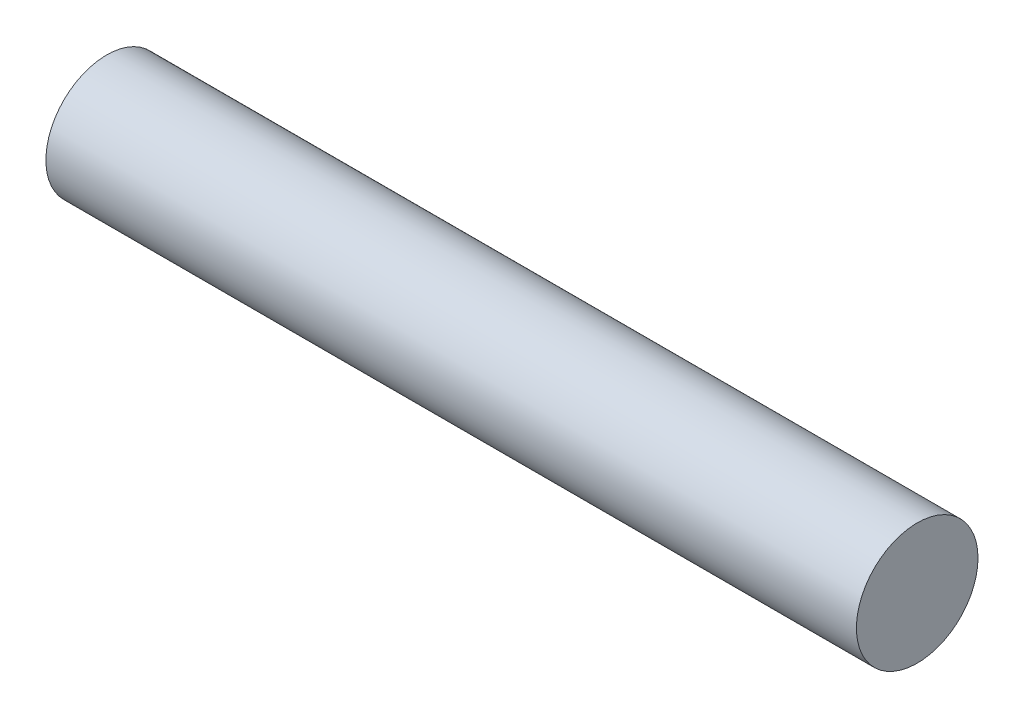
ISO-10303-21;
HEADER;
FILE_DESCRIPTION(('STEP AP214'),'2;1');
FILE_NAME('part.step','',(''),(''),'','','');
FILE_SCHEMA(('AUTOMOTIVE_DESIGN { 1 0 10303 214 1 1 1 1 }'));
ENDSEC;
DATA;
#1=APPLICATION_CONTEXT('core data for automotive mechanical design processes');
#2=APPLICATION_PROTOCOL_DEFINITION('international standard','automotive_design',2000,#1);
#3=PRODUCT_CONTEXT('',#1,'mechanical');
#4=PRODUCT('Part','Part','',(#3));
#5=PRODUCT_RELATED_PRODUCT_CATEGORY('part','',(#4));
#6=PRODUCT_DEFINITION_FORMATION('','',#4);
#7=PRODUCT_DEFINITION_CONTEXT('part definition',#1,'design');
#8=PRODUCT_DEFINITION('design','',#6,#7);
#9=PRODUCT_DEFINITION_SHAPE('','',#8);
#10=(LENGTH_UNIT() NAMED_UNIT(*) SI_UNIT(.MILLI.,.METRE.));
#11=(NAMED_UNIT(*) PLANE_ANGLE_UNIT() SI_UNIT($,.RADIAN.));
#12=(NAMED_UNIT(*) SI_UNIT($,.STERADIAN.) SOLID_ANGLE_UNIT());
#13=UNCERTAINTY_MEASURE_WITH_UNIT(LENGTH_MEASURE(1.E-05),#10,'distance_accuracy_value','');
#14=(GEOMETRIC_REPRESENTATION_CONTEXT(3) GLOBAL_UNCERTAINTY_ASSIGNED_CONTEXT((#13)) GLOBAL_UNIT_ASSIGNED_CONTEXT((#10,
#11,#12)) REPRESENTATION_CONTEXT('',''));
#15=CARTESIAN_POINT('',(0.,0.,0.));
#16=DIRECTION('',(0.,0.,1.));
#17=DIRECTION('',(1.,0.,0.));
#18=AXIS2_PLACEMENT_3D('',#15,#16,#17);
#19=CARTESIAN_POINT('',(10.,0.,0.));
#20=DIRECTION('',(-1.,0.,0.));
#21=DIRECTION('',(0.,0.,1.));
#22=AXIS2_PLACEMENT_3D('',#19,#20,#21);
#23=CYLINDRICAL_SURFACE('',#22,0.75);
#24=CARTESIAN_POINT('',(10.,0.,0.));
#25=DIRECTION('',(1.,0.,0.));
#26=DIRECTION('',(0.,0.,-1.));
#27=AXIS2_PLACEMENT_3D('',#24,#25,#26);
#28=CIRCLE('',#27,0.75);
#29=CARTESIAN_POINT('',(10.,0.,-0.75));
#30=VERTEX_POINT('',#29);
#31=EDGE_CURVE('E10',#30,#30,#28,.T.);
#32=ORIENTED_EDGE('',*,*,#31,.F.);
#33=EDGE_LOOP('',(#32));
#34=FACE_BOUND('',#33,.T.);
#35=CARTESIAN_POINT('',(0.,0.,0.));
#36=DIRECTION('',(1.,0.,0.));
#37=DIRECTION('',(0.,0.,-1.));
#38=AXIS2_PLACEMENT_3D('',#35,#36,#37);
#39=CIRCLE('',#38,0.75);
#40=CARTESIAN_POINT('',(0.,0.,-0.75));
#41=VERTEX_POINT('',#40);
#42=EDGE_CURVE('E37',#41,#41,#39,.T.);
#43=ORIENTED_EDGE('',*,*,#42,.T.);
#44=EDGE_LOOP('',(#43));
#45=FACE_BOUND('',#44,.T.);
#46=ADVANCED_FACE('F34',(#34,#45),#23,.T.);
#47=CARTESIAN_POINT('',(10.,0.,0.));
#48=DIRECTION('',(1.,0.,0.));
#49=DIRECTION('',(0.,0.,-1.));
#50=AXIS2_PLACEMENT_3D('',#47,#48,#49);
#51=PLANE('',#50);
#52=ORIENTED_EDGE('',*,*,#31,.T.);
#53=EDGE_LOOP('',(#52));
#54=FACE_BOUND('',#53,.T.);
#55=ADVANCED_FACE('F49',(#54),#51,.T.);
#56=CARTESIAN_POINT('',(0.,0.,0.));
#57=DIRECTION('',(1.,0.,0.));
#58=DIRECTION('',(0.,0.,-1.));
#59=AXIS2_PLACEMENT_3D('',#56,#57,#58);
#60=PLANE('',#59);
#61=ORIENTED_EDGE('',*,*,#42,.F.);
#62=EDGE_LOOP('',(#61));
#63=FACE_BOUND('',#62,.T.);
#64=ADVANCED_FACE('F47',(#63),#60,.F.);
#65=CLOSED_SHELL('',(#46,#55,#64));
#66=MANIFOLD_SOLID_BREP('B2',#65);
#67=ADVANCED_BREP_SHAPE_REPRESENTATION('',(#18,#66),#14);
#68=SHAPE_DEFINITION_REPRESENTATION(#9,#67);
ENDSEC;
END-ISO-10303-21;
